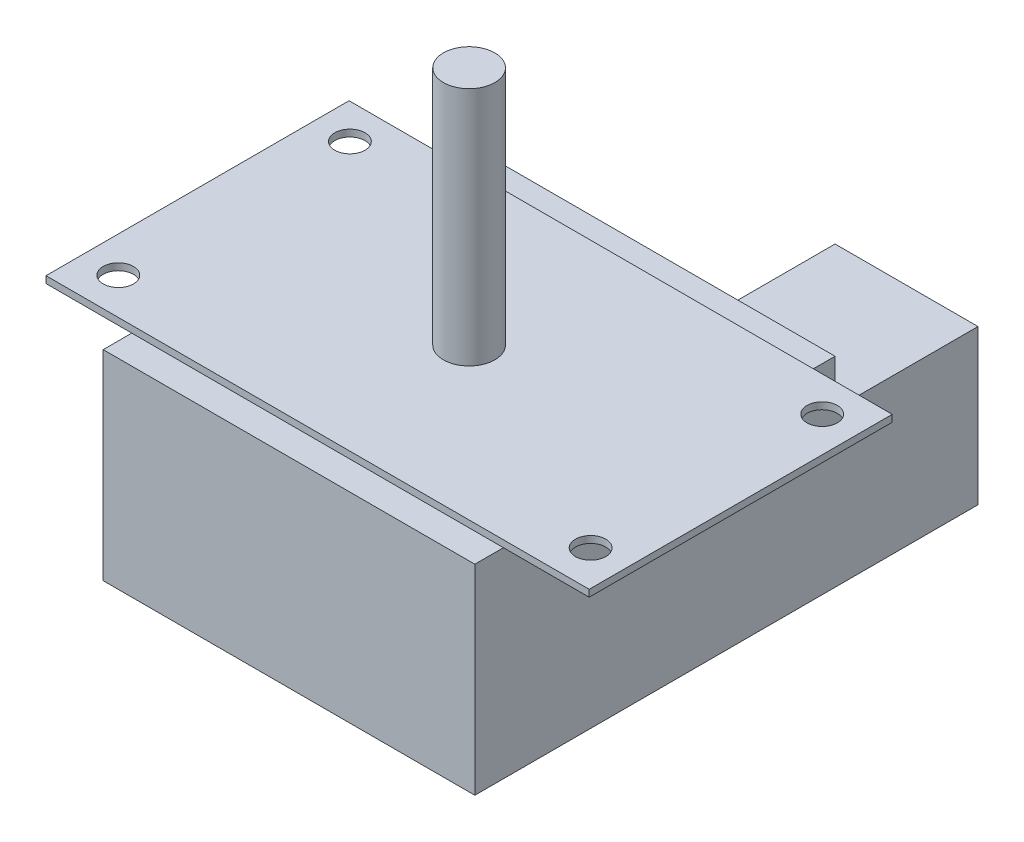
ISO-10303-21;
HEADER;
FILE_DESCRIPTION(('STEP AP214'),'2;1');
FILE_NAME('part.step','',(''),(''),'','','');
FILE_SCHEMA(('AUTOMOTIVE_DESIGN { 1 0 10303 214 1 1 1 1 }'));
ENDSEC;
DATA;
#1=APPLICATION_CONTEXT('core data for automotive mechanical design processes');
#2=APPLICATION_PROTOCOL_DEFINITION('international standard','automotive_design',2000,#1);
#3=PRODUCT_CONTEXT('',#1,'mechanical');
#4=PRODUCT('Part','Part','',(#3));
#5=PRODUCT_RELATED_PRODUCT_CATEGORY('part','',(#4));
#6=PRODUCT_DEFINITION_FORMATION('','',#4);
#7=PRODUCT_DEFINITION_CONTEXT('part definition',#1,'design');
#8=PRODUCT_DEFINITION('design','',#6,#7);
#9=PRODUCT_DEFINITION_SHAPE('','',#8);
#10=(LENGTH_UNIT() NAMED_UNIT(*) SI_UNIT(.MILLI.,.METRE.));
#11=(NAMED_UNIT(*) PLANE_ANGLE_UNIT() SI_UNIT($,.RADIAN.));
#12=(NAMED_UNIT(*) SI_UNIT($,.STERADIAN.) SOLID_ANGLE_UNIT());
#13=UNCERTAINTY_MEASURE_WITH_UNIT(LENGTH_MEASURE(1.E-05),#10,'distance_accuracy_value','');
#14=(GEOMETRIC_REPRESENTATION_CONTEXT(3) GLOBAL_UNCERTAINTY_ASSIGNED_CONTEXT((#13)) GLOBAL_UNIT_ASSIGNED_CONTEXT((#10,
#11,#12)) REPRESENTATION_CONTEXT('',''));
#15=CARTESIAN_POINT('',(0.,0.,0.));
#16=DIRECTION('',(0.,0.,1.));
#17=DIRECTION('',(1.,0.,0.));
#18=AXIS2_PLACEMENT_3D('',#15,#16,#17);
#19=CARTESIAN_POINT('',(0.,0.,0.));
#20=DIRECTION('',(0.,1.,0.));
#21=DIRECTION('',(0.,0.,1.));
#22=AXIS2_PLACEMENT_3D('',#19,#20,#21);
#23=PLANE('',#22);
#24=CARTESIAN_POINT('',(41.35,0.,20.1));
#25=DIRECTION('',(0.,1.,0.));
#26=DIRECTION('',(0.,0.,1.));
#27=AXIS2_PLACEMENT_3D('',#24,#25,#26);
#28=CIRCLE('',#27,2.64999999999999);
#29=CARTESIAN_POINT('',(41.35,0.,22.75));
#30=VERTEX_POINT('',#29);
#31=EDGE_CURVE('E277',#30,#30,#28,.T.);
#32=ORIENTED_EDGE('',*,*,#31,.T.);
#33=EDGE_LOOP('',(#32));
#34=FACE_BOUND('',#33,.T.);
#35=CARTESIAN_POINT('',(41.35,0.,-20.4));
#36=DIRECTION('',(0.,1.,0.));
#37=DIRECTION('',(0.,0.,1.));
#38=AXIS2_PLACEMENT_3D('',#35,#36,#37);
#39=CIRCLE('',#38,2.64999999999999);
#40=CARTESIAN_POINT('',(41.35,0.,-17.75));
#41=VERTEX_POINT('',#40);
#42=EDGE_CURVE('E269',#41,#41,#39,.T.);
#43=ORIENTED_EDGE('',*,*,#42,.T.);
#44=EDGE_LOOP('',(#43));
#45=FACE_BOUND('',#44,.T.);
#46=DIRECTION('',(0.,0.,1.));
#47=VECTOR('',#46,1.);
#48=CARTESIAN_POINT('',(32.5,0.,31.5));
#49=LINE('',#48,#47);
#50=CARTESIAN_POINT('',(32.5,0.,-26.5));
#51=VERTEX_POINT('',#50);
#52=CARTESIAN_POINT('',(32.5,0.,26.5));
#53=VERTEX_POINT('',#52);
#54=EDGE_CURVE('E11',#51,#53,#49,.T.);
#55=ORIENTED_EDGE('',*,*,#54,.F.);
#56=DIRECTION('',(1.,0.,0.));
#57=VECTOR('',#56,1.);
#58=CARTESIAN_POINT('',(-47.5,0.,-26.5));
#59=LINE('',#58,#57);
#60=CARTESIAN_POINT('',(47.5,0.,-26.5));
#61=VERTEX_POINT('',#60);
#62=EDGE_CURVE('E173',#51,#61,#59,.T.);
#63=ORIENTED_EDGE('',*,*,#62,.T.);
#64=DIRECTION('',(0.,0.,-1.));
#65=VECTOR('',#64,1.);
#66=CARTESIAN_POINT('',(47.5,0.,26.5));
#67=LINE('',#66,#65);
#68=CARTESIAN_POINT('',(47.5,0.,26.5));
#69=VERTEX_POINT('',#68);
#70=EDGE_CURVE('E187',#69,#61,#67,.T.);
#71=ORIENTED_EDGE('',*,*,#70,.F.);
#72=DIRECTION('',(1.,0.,0.));
#73=VECTOR('',#72,1.);
#74=CARTESIAN_POINT('',(-47.5,0.,26.5));
#75=LINE('',#74,#73);
#76=EDGE_CURVE('E52',#53,#69,#75,.T.);
#77=ORIENTED_EDGE('',*,*,#76,.F.);
#78=EDGE_LOOP('',(#55,#63,#71,#77));
#79=FACE_BOUND('',#78,.T.);
#80=ADVANCED_FACE('F33',(#34,#45,#79),#23,.F.);
#81=CARTESIAN_POINT('',(-41.25,0.,-20.4));
#82=DIRECTION('',(0.,1.,0.));
#83=DIRECTION('',(0.,0.,1.));
#84=AXIS2_PLACEMENT_3D('',#81,#82,#83);
#85=CIRCLE('',#84,2.64999999999999);
#86=CARTESIAN_POINT('',(-41.25,0.,-17.75));
#87=VERTEX_POINT('',#86);
#88=EDGE_CURVE('E289',#87,#87,#85,.T.);
#89=ORIENTED_EDGE('',*,*,#88,.T.);
#90=EDGE_LOOP('',(#89));
#91=FACE_BOUND('',#90,.T.);
#92=CARTESIAN_POINT('',(-41.25,0.,20.1));
#93=DIRECTION('',(0.,1.,0.));
#94=DIRECTION('',(0.,0.,1.));
#95=AXIS2_PLACEMENT_3D('',#92,#93,#94);
#96=CIRCLE('',#95,2.64999999999999);
#97=CARTESIAN_POINT('',(-41.25,0.,22.75));
#98=VERTEX_POINT('',#97);
#99=EDGE_CURVE('E283',#98,#98,#96,.T.);
#100=ORIENTED_EDGE('',*,*,#99,.T.);
#101=EDGE_LOOP('',(#100));
#102=FACE_BOUND('',#101,.T.);
#103=DIRECTION('',(0.,0.,-1.));
#104=VECTOR('',#103,1.);
#105=CARTESIAN_POINT('',(-32.5,0.,-31.5));
#106=LINE('',#105,#104);
#107=CARTESIAN_POINT('',(-32.5,0.,26.5));
#108=VERTEX_POINT('',#107);
#109=CARTESIAN_POINT('',(-32.5,0.,-26.5));
#110=VERTEX_POINT('',#109);
#111=EDGE_CURVE('E42',#108,#110,#106,.T.);
#112=ORIENTED_EDGE('',*,*,#111,.F.);
#113=CARTESIAN_POINT('',(-47.5,0.,26.5));
#114=VERTEX_POINT('',#113);
#115=EDGE_CURVE('E191',#114,#108,#75,.T.);
#116=ORIENTED_EDGE('',*,*,#115,.F.);
#117=DIRECTION('',(0.,0.,-1.));
#118=VECTOR('',#117,1.);
#119=CARTESIAN_POINT('',(-47.5,0.,26.5));
#120=LINE('',#119,#118);
#121=CARTESIAN_POINT('',(-47.5,0.,-26.5));
#122=VERTEX_POINT('',#121);
#123=EDGE_CURVE('E178',#114,#122,#120,.T.);
#124=ORIENTED_EDGE('',*,*,#123,.T.);
#125=EDGE_CURVE('E185',#122,#110,#59,.T.);
#126=ORIENTED_EDGE('',*,*,#125,.T.);
#127=EDGE_LOOP('',(#112,#116,#124,#126));
#128=FACE_BOUND('',#127,.T.);
#129=ADVANCED_FACE('F220',(#91,#102,#128),#23,.F.);
#130=CARTESIAN_POINT('',(-47.5,1.2,-26.5));
#131=DIRECTION('',(0.,0.,-1.));
#132=DIRECTION('',(-1.,0.,0.));
#133=AXIS2_PLACEMENT_3D('',#130,#131,#132);
#134=PLANE('',#133);
#135=ORIENTED_EDGE('',*,*,#125,.F.);
#136=DIRECTION('',(0.,-1.,0.));
#137=VECTOR('',#136,1.);
#138=CARTESIAN_POINT('',(-47.5,1.2,-26.5));
#139=LINE('',#138,#137);
#140=CARTESIAN_POINT('',(-47.5,1.2,-26.5));
#141=VERTEX_POINT('',#140);
#142=EDGE_CURVE('E196',#141,#122,#139,.T.);
#143=ORIENTED_EDGE('',*,*,#142,.F.);
#144=DIRECTION('',(1.,0.,0.));
#145=VECTOR('',#144,1.);
#146=CARTESIAN_POINT('',(-47.5,1.2,-26.5));
#147=LINE('',#146,#145);
#148=CARTESIAN_POINT('',(47.5,1.2,-26.5));
#149=VERTEX_POINT('',#148);
#150=EDGE_CURVE('E174',#141,#149,#147,.T.);
#151=ORIENTED_EDGE('',*,*,#150,.T.);
#152=DIRECTION('',(0.,-1.,0.));
#153=VECTOR('',#152,1.);
#154=CARTESIAN_POINT('',(47.5,1.2,-26.5));
#155=LINE('',#154,#153);
#156=EDGE_CURVE('E37',#149,#61,#155,.T.);
#157=ORIENTED_EDGE('',*,*,#156,.T.);
#158=ORIENTED_EDGE('',*,*,#62,.F.);
#159=EDGE_CURVE('E188',#110,#51,#59,.T.);
#160=ORIENTED_EDGE('',*,*,#159,.F.);
#161=EDGE_LOOP('',(#135,#143,#151,#157,#158,#160));
#162=FACE_BOUND('',#161,.T.);
#163=ADVANCED_FACE('F35',(#162),#134,.T.);
#164=CARTESIAN_POINT('',(-47.5,1.2,26.5));
#165=DIRECTION('',(-1.,0.,0.));
#166=DIRECTION('',(0.,0.,1.));
#167=AXIS2_PLACEMENT_3D('',#164,#165,#166);
#168=PLANE('',#167);
#169=ORIENTED_EDGE('',*,*,#123,.F.);
#170=DIRECTION('',(0.,-1.,0.));
#171=VECTOR('',#170,1.);
#172=CARTESIAN_POINT('',(-47.5,1.2,26.5));
#173=LINE('',#172,#171);
#174=CARTESIAN_POINT('',(-47.5,1.2,26.5));
#175=VERTEX_POINT('',#174);
#176=EDGE_CURVE('E198',#175,#114,#173,.T.);
#177=ORIENTED_EDGE('',*,*,#176,.F.);
#178=DIRECTION('',(0.,0.,-1.));
#179=VECTOR('',#178,1.);
#180=CARTESIAN_POINT('',(-47.5,1.2,26.5));
#181=LINE('',#180,#179);
#182=EDGE_CURVE('E182',#175,#141,#181,.T.);
#183=ORIENTED_EDGE('',*,*,#182,.T.);
#184=ORIENTED_EDGE('',*,*,#142,.T.);
#185=EDGE_LOOP('',(#169,#177,#183,#184));
#186=FACE_BOUND('',#185,.T.);
#187=ADVANCED_FACE('F222',(#186),#168,.T.);
#188=CARTESIAN_POINT('',(-47.5,1.2,26.5));
#189=DIRECTION('',(0.,0.,-1.));
#190=DIRECTION('',(-1.,0.,0.));
#191=AXIS2_PLACEMENT_3D('',#188,#189,#190);
#192=PLANE('',#191);
#193=ORIENTED_EDGE('',*,*,#115,.T.);
#194=EDGE_CURVE('E193',#108,#53,#75,.T.);
#195=ORIENTED_EDGE('',*,*,#194,.T.);
#196=ORIENTED_EDGE('',*,*,#76,.T.);
#197=DIRECTION('',(0.,-1.,0.));
#198=VECTOR('',#197,1.);
#199=CARTESIAN_POINT('',(47.5,1.2,26.5));
#200=LINE('',#199,#198);
#201=CARTESIAN_POINT('',(47.5,1.2,26.5));
#202=VERTEX_POINT('',#201);
#203=EDGE_CURVE('E199',#202,#69,#200,.T.);
#204=ORIENTED_EDGE('',*,*,#203,.F.);
#205=DIRECTION('',(1.,0.,0.));
#206=VECTOR('',#205,1.);
#207=CARTESIAN_POINT('',(-47.5,1.2,26.5));
#208=LINE('',#207,#206);
#209=EDGE_CURVE('E180',#175,#202,#208,.T.);
#210=ORIENTED_EDGE('',*,*,#209,.F.);
#211=ORIENTED_EDGE('',*,*,#176,.T.);
#212=EDGE_LOOP('',(#193,#195,#196,#204,#210,#211));
#213=FACE_BOUND('',#212,.T.);
#214=ADVANCED_FACE('F228',(#213),#192,.F.);
#215=CARTESIAN_POINT('',(47.5,1.2,26.5));
#216=DIRECTION('',(-1.,0.,0.));
#217=DIRECTION('',(0.,0.,1.));
#218=AXIS2_PLACEMENT_3D('',#215,#216,#217);
#219=PLANE('',#218);
#220=ORIENTED_EDGE('',*,*,#70,.T.);
#221=ORIENTED_EDGE('',*,*,#156,.F.);
#222=DIRECTION('',(0.,0.,-1.));
#223=VECTOR('',#222,1.);
#224=CARTESIAN_POINT('',(47.5,1.2,26.5));
#225=LINE('',#224,#223);
#226=EDGE_CURVE('E177',#202,#149,#225,.T.);
#227=ORIENTED_EDGE('',*,*,#226,.F.);
#228=ORIENTED_EDGE('',*,*,#203,.T.);
#229=EDGE_LOOP('',(#220,#221,#227,#228));
#230=FACE_BOUND('',#229,.T.);
#231=ADVANCED_FACE('F212',(#230),#219,.F.);
#232=CARTESIAN_POINT('',(0.,1.2,0.));
#233=DIRECTION('',(0.,1.,0.));
#234=DIRECTION('',(0.,0.,1.));
#235=AXIS2_PLACEMENT_3D('',#232,#233,#234);
#236=PLANE('',#235);
#237=CARTESIAN_POINT('',(-41.25,1.2,-20.4));
#238=DIRECTION('',(0.,1.,0.));
#239=DIRECTION('',(0.,0.,1.));
#240=AXIS2_PLACEMENT_3D('',#237,#238,#239);
#241=CIRCLE('',#240,2.64999999999999);
#242=CARTESIAN_POINT('',(-41.25,1.2,-17.75));
#243=VERTEX_POINT('',#242);
#244=EDGE_CURVE('E292',#243,#243,#241,.T.);
#245=ORIENTED_EDGE('',*,*,#244,.F.);
#246=EDGE_LOOP('',(#245));
#247=FACE_BOUND('',#246,.T.);
#248=CARTESIAN_POINT('',(-41.25,1.2,20.1));
#249=DIRECTION('',(0.,1.,0.));
#250=DIRECTION('',(0.,0.,1.));
#251=AXIS2_PLACEMENT_3D('',#248,#249,#250);
#252=CIRCLE('',#251,2.64999999999999);
#253=CARTESIAN_POINT('',(-41.25,1.2,22.75));
#254=VERTEX_POINT('',#253);
#255=EDGE_CURVE('E286',#254,#254,#252,.T.);
#256=ORIENTED_EDGE('',*,*,#255,.F.);
#257=EDGE_LOOP('',(#256));
#258=FACE_BOUND('',#257,.T.);
#259=CARTESIAN_POINT('',(41.35,1.2,20.1));
#260=DIRECTION('',(0.,1.,0.));
#261=DIRECTION('',(0.,0.,1.));
#262=AXIS2_PLACEMENT_3D('',#259,#260,#261);
#263=CIRCLE('',#262,2.64999999999999);
#264=CARTESIAN_POINT('',(41.35,1.2,22.75));
#265=VERTEX_POINT('',#264);
#266=EDGE_CURVE('E280',#265,#265,#263,.T.);
#267=ORIENTED_EDGE('',*,*,#266,.F.);
#268=EDGE_LOOP('',(#267));
#269=FACE_BOUND('',#268,.T.);
#270=CARTESIAN_POINT('',(41.35,1.2,-20.4));
#271=DIRECTION('',(0.,1.,0.));
#272=DIRECTION('',(0.,0.,1.));
#273=AXIS2_PLACEMENT_3D('',#270,#271,#272);
#274=CIRCLE('',#273,2.64999999999999);
#275=CARTESIAN_POINT('',(41.35,1.2,-17.75));
#276=VERTEX_POINT('',#275);
#277=EDGE_CURVE('E274',#276,#276,#274,.T.);
#278=ORIENTED_EDGE('',*,*,#277,.F.);
#279=EDGE_LOOP('',(#278));
#280=FACE_BOUND('',#279,.T.);
#281=CARTESIAN_POINT('',(0.,1.2,0.));
#282=DIRECTION('',(0.,1.,0.));
#283=DIRECTION('',(0.,0.,1.));
#284=AXIS2_PLACEMENT_3D('',#281,#282,#283);
#285=CIRCLE('',#284,4.5);
#286=CARTESIAN_POINT('',(0.,1.2,-4.5));
#287=VERTEX_POINT('',#286);
#288=EDGE_CURVE('E266',#287,#287,#285,.T.);
#289=ORIENTED_EDGE('',*,*,#288,.F.);
#290=EDGE_LOOP('',(#289));
#291=FACE_BOUND('',#290,.T.);
#292=ORIENTED_EDGE('',*,*,#150,.F.);
#293=ORIENTED_EDGE('',*,*,#182,.F.);
#294=ORIENTED_EDGE('',*,*,#209,.T.);
#295=ORIENTED_EDGE('',*,*,#226,.T.);
#296=EDGE_LOOP('',(#292,#293,#294,#295));
#297=FACE_BOUND('',#296,.T.);
#298=ADVANCED_FACE('F226',(#247,#258,#269,#280,#291,#297),#236,.T.);
#299=CARTESIAN_POINT('',(0.,0.,0.));
#300=DIRECTION('',(0.,1.,0.));
#301=DIRECTION('',(0.,0.,1.));
#302=AXIS2_PLACEMENT_3D('',#299,#300,#301);
#303=PLANE('',#302);
#304=ORIENTED_EDGE('',*,*,#194,.F.);
#305=CARTESIAN_POINT('',(-32.5,0.,31.5));
#306=VERTEX_POINT('',#305);
#307=EDGE_CURVE('E245',#306,#108,#106,.T.);
#308=ORIENTED_EDGE('',*,*,#307,.F.);
#309=DIRECTION('',(-1.,0.,0.));
#310=VECTOR('',#309,1.);
#311=CARTESIAN_POINT('',(-32.5,0.,31.5));
#312=LINE('',#311,#310);
#313=CARTESIAN_POINT('',(32.5,0.,31.5));
#314=VERTEX_POINT('',#313);
#315=EDGE_CURVE('E236',#314,#306,#312,.T.);
#316=ORIENTED_EDGE('',*,*,#315,.F.);
#317=EDGE_CURVE('E45',#53,#314,#49,.T.);
#318=ORIENTED_EDGE('',*,*,#317,.F.);
#319=EDGE_LOOP('',(#304,#308,#316,#318));
#320=FACE_BOUND('',#319,.T.);
#321=ADVANCED_FACE('F235',(#320),#303,.T.);
#322=CARTESIAN_POINT('',(32.5,-35.,31.5));
#323=DIRECTION('',(-1.,0.,0.));
#324=DIRECTION('',(0.,0.,1.));
#325=AXIS2_PLACEMENT_3D('',#322,#323,#324);
#326=PLANE('',#325);
#327=DIRECTION('',(0.,0.,-1.));
#328=VECTOR('',#327,1.);
#329=CARTESIAN_POINT('',(32.5,-8.,-31.5));
#330=LINE('',#329,#328);
#331=CARTESIAN_POINT('',(32.5,-8.,-31.5));
#332=VERTEX_POINT('',#331);
#333=CARTESIAN_POINT('',(32.5,-8.,-56.5));
#334=VERTEX_POINT('',#333);
#335=EDGE_CURVE('E144',#332,#334,#330,.T.);
#336=ORIENTED_EDGE('',*,*,#335,.F.);
#337=DIRECTION('',(0.,1.,0.));
#338=VECTOR('',#337,1.);
#339=CARTESIAN_POINT('',(32.5,-8.,-31.5));
#340=LINE('',#339,#338);
#341=CARTESIAN_POINT('',(32.5,0.,-31.5));
#342=VERTEX_POINT('',#341);
#343=EDGE_CURVE('E141',#332,#342,#340,.T.);
#344=ORIENTED_EDGE('',*,*,#343,.T.);
#345=EDGE_CURVE('E44',#342,#51,#49,.T.);
#346=ORIENTED_EDGE('',*,*,#345,.T.);
#347=ORIENTED_EDGE('',*,*,#54,.T.);
#348=ORIENTED_EDGE('',*,*,#317,.T.);
#349=DIRECTION('',(0.,1.,0.));
#350=VECTOR('',#349,1.);
#351=CARTESIAN_POINT('',(32.5,-35.,31.5));
#352=LINE('',#351,#350);
#353=CARTESIAN_POINT('',(32.5,-35.,31.5));
#354=VERTEX_POINT('',#353);
#355=EDGE_CURVE('E170',#354,#314,#352,.T.);
#356=ORIENTED_EDGE('',*,*,#355,.F.);
#357=DIRECTION('',(0.,0.,1.));
#358=VECTOR('',#357,1.);
#359=CARTESIAN_POINT('',(32.5,-35.,31.5));
#360=LINE('',#359,#358);
#361=CARTESIAN_POINT('',(32.5,-35.,-56.5));
#362=VERTEX_POINT('',#361);
#363=EDGE_CURVE('E248',#362,#354,#360,.T.);
#364=ORIENTED_EDGE('',*,*,#363,.F.);
#365=DIRECTION('',(0.,1.,0.));
#366=VECTOR('',#365,1.);
#367=CARTESIAN_POINT('',(32.5,-35.,-56.5));
#368=LINE('',#367,#366);
#369=EDGE_CURVE('E164',#362,#334,#368,.T.);
#370=ORIENTED_EDGE('',*,*,#369,.T.);
#371=EDGE_LOOP('',(#336,#344,#346,#347,#348,#356,#364,#370));
#372=FACE_BOUND('',#371,.T.);
#373=ADVANCED_FACE('F239',(#372),#326,.F.);
#374=CARTESIAN_POINT('',(-32.5,-35.,31.5));
#375=DIRECTION('',(0.,0.,-1.));
#376=DIRECTION('',(-1.,0.,0.));
#377=AXIS2_PLACEMENT_3D('',#374,#375,#376);
#378=PLANE('',#377);
#379=ORIENTED_EDGE('',*,*,#315,.T.);
#380=DIRECTION('',(0.,1.,0.));
#381=VECTOR('',#380,1.);
#382=CARTESIAN_POINT('',(-32.5,-35.,31.5));
#383=LINE('',#382,#381);
#384=CARTESIAN_POINT('',(-32.5,-35.,31.5));
#385=VERTEX_POINT('',#384);
#386=EDGE_CURVE('E162',#385,#306,#383,.T.);
#387=ORIENTED_EDGE('',*,*,#386,.F.);
#388=DIRECTION('',(-1.,0.,0.));
#389=VECTOR('',#388,1.);
#390=CARTESIAN_POINT('',(-32.5,-35.,31.5));
#391=LINE('',#390,#389);
#392=EDGE_CURVE('E260',#354,#385,#391,.T.);
#393=ORIENTED_EDGE('',*,*,#392,.F.);
#394=ORIENTED_EDGE('',*,*,#355,.T.);
#395=EDGE_LOOP('',(#379,#387,#393,#394));
#396=FACE_BOUND('',#395,.T.);
#397=ADVANCED_FACE('F362',(#396),#378,.F.);
#398=CARTESIAN_POINT('',(-32.5,-35.,-31.5));
#399=DIRECTION('',(1.,0.,0.));
#400=DIRECTION('',(0.,0.,-1.));
#401=AXIS2_PLACEMENT_3D('',#398,#399,#400);
#402=PLANE('',#401);
#403=ORIENTED_EDGE('',*,*,#307,.T.);
#404=ORIENTED_EDGE('',*,*,#111,.T.);
#405=CARTESIAN_POINT('',(-32.5,0.,-31.5));
#406=VERTEX_POINT('',#405);
#407=EDGE_CURVE('E218',#110,#406,#106,.T.);
#408=ORIENTED_EDGE('',*,*,#407,.T.);
#409=DIRECTION('',(0.,1.,0.));
#410=VECTOR('',#409,1.);
#411=CARTESIAN_POINT('',(-32.5,-35.,-31.5));
#412=LINE('',#411,#410);
#413=CARTESIAN_POINT('',(-32.5,-35.,-31.5));
#414=VERTEX_POINT('',#413);
#415=EDGE_CURVE('E158',#414,#406,#412,.T.);
#416=ORIENTED_EDGE('',*,*,#415,.F.);
#417=DIRECTION('',(0.,0.,-1.));
#418=VECTOR('',#417,1.);
#419=CARTESIAN_POINT('',(-32.5,-35.,-31.5));
#420=LINE('',#419,#418);
#421=EDGE_CURVE('E256',#385,#414,#420,.T.);
#422=ORIENTED_EDGE('',*,*,#421,.F.);
#423=ORIENTED_EDGE('',*,*,#386,.T.);
#424=EDGE_LOOP('',(#403,#404,#408,#416,#422,#423));
#425=FACE_BOUND('',#424,.T.);
#426=ADVANCED_FACE('F369',(#425),#402,.F.);
#427=CARTESIAN_POINT('',(7.49999999999999,-35.,-31.5));
#428=DIRECTION('',(0.,0.,1.));
#429=DIRECTION('',(1.,0.,0.));
#430=AXIS2_PLACEMENT_3D('',#427,#428,#429);
#431=PLANE('',#430);
#432=DIRECTION('',(1.,0.,0.));
#433=VECTOR('',#432,1.);
#434=CARTESIAN_POINT('',(7.49999999999999,0.,-31.5));
#435=LINE('',#434,#433);
#436=EDGE_CURVE('E247',#406,#342,#435,.T.);
#437=ORIENTED_EDGE('',*,*,#436,.T.);
#438=ORIENTED_EDGE('',*,*,#343,.F.);
#439=DIRECTION('',(1.,0.,0.));
#440=VECTOR('',#439,1.);
#441=CARTESIAN_POINT('',(7.49999999999999,-8.,-31.5));
#442=LINE('',#441,#440);
#443=CARTESIAN_POINT('',(7.49999999999999,-8.,-31.5));
#444=VERTEX_POINT('',#443);
#445=EDGE_CURVE('E133',#444,#332,#442,.T.);
#446=ORIENTED_EDGE('',*,*,#445,.F.);
#447=DIRECTION('',(0.,1.,0.));
#448=VECTOR('',#447,1.);
#449=CARTESIAN_POINT('',(7.49999999999999,-35.,-31.5));
#450=LINE('',#449,#448);
#451=CARTESIAN_POINT('',(7.49999999999999,-35.,-31.5));
#452=VERTEX_POINT('',#451);
#453=EDGE_CURVE('E138',#452,#444,#450,.T.);
#454=ORIENTED_EDGE('',*,*,#453,.F.);
#455=DIRECTION('',(1.,0.,0.));
#456=VECTOR('',#455,1.);
#457=CARTESIAN_POINT('',(7.49999999999999,-35.,-31.5));
#458=LINE('',#457,#456);
#459=EDGE_CURVE('E255',#414,#452,#458,.T.);
#460=ORIENTED_EDGE('',*,*,#459,.F.);
#461=ORIENTED_EDGE('',*,*,#415,.T.);
#462=EDGE_LOOP('',(#437,#438,#446,#454,#460,#461));
#463=FACE_BOUND('',#462,.T.);
#464=ADVANCED_FACE('F135',(#463),#431,.F.);
#465=CARTESIAN_POINT('',(7.49999999999999,-35.,-56.5));
#466=DIRECTION('',(1.,0.,0.));
#467=DIRECTION('',(0.,0.,-1.));
#468=AXIS2_PLACEMENT_3D('',#465,#466,#467);
#469=PLANE('',#468);
#470=ORIENTED_EDGE('',*,*,#453,.T.);
#471=DIRECTION('',(0.,0.,1.));
#472=VECTOR('',#471,1.);
#473=CARTESIAN_POINT('',(7.49999999999999,-8.,-31.5));
#474=LINE('',#473,#472);
#475=CARTESIAN_POINT('',(7.49999999999999,-8.,-56.5));
#476=VERTEX_POINT('',#475);
#477=EDGE_CURVE('E145',#476,#444,#474,.T.);
#478=ORIENTED_EDGE('',*,*,#477,.F.);
#479=DIRECTION('',(0.,1.,0.));
#480=VECTOR('',#479,1.);
#481=CARTESIAN_POINT('',(7.49999999999999,-35.,-56.5));
#482=LINE('',#481,#480);
#483=CARTESIAN_POINT('',(7.49999999999999,-35.,-56.5));
#484=VERTEX_POINT('',#483);
#485=EDGE_CURVE('E159',#484,#476,#482,.T.);
#486=ORIENTED_EDGE('',*,*,#485,.F.);
#487=DIRECTION('',(0.,0.,-1.));
#488=VECTOR('',#487,1.);
#489=CARTESIAN_POINT('',(7.49999999999999,-35.,-56.5));
#490=LINE('',#489,#488);
#491=EDGE_CURVE('E157',#452,#484,#490,.T.);
#492=ORIENTED_EDGE('',*,*,#491,.F.);
#493=EDGE_LOOP('',(#470,#478,#486,#492));
#494=FACE_BOUND('',#493,.T.);
#495=ADVANCED_FACE('F156',(#494),#469,.F.);
#496=CARTESIAN_POINT('',(32.5,-35.,-56.5));
#497=DIRECTION('',(0.,0.,1.));
#498=DIRECTION('',(1.,0.,0.));
#499=AXIS2_PLACEMENT_3D('',#496,#497,#498);
#500=PLANE('',#499);
#501=ORIENTED_EDGE('',*,*,#485,.T.);
#502=DIRECTION('',(-1.,0.,0.));
#503=VECTOR('',#502,1.);
#504=CARTESIAN_POINT('',(7.49999999999999,-8.,-56.5));
#505=LINE('',#504,#503);
#506=EDGE_CURVE('E150',#334,#476,#505,.T.);
#507=ORIENTED_EDGE('',*,*,#506,.F.);
#508=ORIENTED_EDGE('',*,*,#369,.F.);
#509=DIRECTION('',(1.,0.,0.));
#510=VECTOR('',#509,1.);
#511=CARTESIAN_POINT('',(32.5,-35.,-56.5));
#512=LINE('',#511,#510);
#513=EDGE_CURVE('E242',#484,#362,#512,.T.);
#514=ORIENTED_EDGE('',*,*,#513,.F.);
#515=EDGE_LOOP('',(#501,#507,#508,#514));
#516=FACE_BOUND('',#515,.T.);
#517=ADVANCED_FACE('F389',(#516),#500,.F.);
#518=CARTESIAN_POINT('',(0.,-35.,0.));
#519=DIRECTION('',(0.,1.,0.));
#520=DIRECTION('',(0.,0.,1.));
#521=AXIS2_PLACEMENT_3D('',#518,#519,#520);
#522=PLANE('',#521);
#523=ORIENTED_EDGE('',*,*,#363,.T.);
#524=ORIENTED_EDGE('',*,*,#392,.T.);
#525=ORIENTED_EDGE('',*,*,#421,.T.);
#526=ORIENTED_EDGE('',*,*,#459,.T.);
#527=ORIENTED_EDGE('',*,*,#491,.T.);
#528=ORIENTED_EDGE('',*,*,#513,.T.);
#529=EDGE_LOOP('',(#523,#524,#525,#526,#527,#528));
#530=FACE_BOUND('',#529,.T.);
#531=ADVANCED_FACE('F396',(#530),#522,.F.);
#532=ORIENTED_EDGE('',*,*,#345,.F.);
#533=ORIENTED_EDGE('',*,*,#436,.F.);
#534=ORIENTED_EDGE('',*,*,#407,.F.);
#535=ORIENTED_EDGE('',*,*,#159,.T.);
#536=EDGE_LOOP('',(#532,#533,#534,#535));
#537=FACE_BOUND('',#536,.T.);
#538=ADVANCED_FACE('F216',(#537),#303,.T.);
#539=CARTESIAN_POINT('',(0.,-8.,0.));
#540=DIRECTION('',(0.,-1.,0.));
#541=DIRECTION('',(0.,0.,-1.));
#542=AXIS2_PLACEMENT_3D('',#539,#540,#541);
#543=PLANE('',#542);
#544=ORIENTED_EDGE('',*,*,#477,.T.);
#545=ORIENTED_EDGE('',*,*,#445,.T.);
#546=ORIENTED_EDGE('',*,*,#335,.T.);
#547=ORIENTED_EDGE('',*,*,#506,.T.);
#548=EDGE_LOOP('',(#544,#545,#546,#547));
#549=FACE_BOUND('',#548,.T.);
#550=ADVANCED_FACE('F148',(#549),#543,.F.);
#551=CARTESIAN_POINT('',(0.,43.2,0.));
#552=DIRECTION('',(0.,-1.,0.));
#553=DIRECTION('',(0.,0.,-1.));
#554=AXIS2_PLACEMENT_3D('',#551,#552,#553);
#555=CYLINDRICAL_SURFACE('',#554,4.5);
#556=CARTESIAN_POINT('',(0.,43.2,0.));
#557=DIRECTION('',(0.,1.,0.));
#558=DIRECTION('',(0.,0.,1.));
#559=AXIS2_PLACEMENT_3D('',#556,#557,#558);
#560=CIRCLE('',#559,4.5);
#561=CARTESIAN_POINT('',(0.,43.2,-4.5));
#562=VERTEX_POINT('',#561);
#563=EDGE_CURVE('E154',#562,#562,#560,.T.);
#564=CARTESIAN_POINT('',(0.,43.2,-4.5));
#565=CARTESIAN_POINT('',(0.,42.7625,-4.5));
#566=CARTESIAN_POINT('',(0.,42.325,-4.5));
#567=CARTESIAN_POINT('',(0.,41.45,-4.5));
#568=CARTESIAN_POINT('',(0.,41.0125,-4.5));
#569=CARTESIAN_POINT('',(0.,40.1375,-4.5));
#570=CARTESIAN_POINT('',(0.,39.7,-4.5));
#571=CARTESIAN_POINT('',(0.,38.825,-4.5));
#572=CARTESIAN_POINT('',(0.,38.3875,-4.5));
#573=CARTESIAN_POINT('',(0.,37.5125,-4.5));
#574=CARTESIAN_POINT('',(0.,37.075,-4.5));
#575=CARTESIAN_POINT('',(0.,36.2,-4.5));
#576=CARTESIAN_POINT('',(0.,35.7625,-4.5));
#577=CARTESIAN_POINT('',(0.,34.8875,-4.5));
#578=CARTESIAN_POINT('',(0.,34.45,-4.5));
#579=CARTESIAN_POINT('',(0.,33.575,-4.5));
#580=CARTESIAN_POINT('',(0.,33.1375,-4.5));
#581=CARTESIAN_POINT('',(0.,32.2625,-4.5));
#582=CARTESIAN_POINT('',(0.,31.825,-4.5));
#583=CARTESIAN_POINT('',(0.,30.95,-4.5));
#584=CARTESIAN_POINT('',(0.,30.5125,-4.5));
#585=CARTESIAN_POINT('',(0.,29.6375,-4.5));
#586=CARTESIAN_POINT('',(0.,29.2,-4.5));
#587=CARTESIAN_POINT('',(0.,28.325,-4.5));
#588=CARTESIAN_POINT('',(0.,27.8875,-4.5));
#589=CARTESIAN_POINT('',(0.,27.0125,-4.5));
#590=CARTESIAN_POINT('',(0.,26.575,-4.5));
#591=CARTESIAN_POINT('',(0.,25.7,-4.5));
#592=CARTESIAN_POINT('',(0.,25.2625,-4.5));
#593=CARTESIAN_POINT('',(0.,24.3875,-4.5));
#594=CARTESIAN_POINT('',(0.,23.95,-4.5));
#595=CARTESIAN_POINT('',(0.,23.075,-4.5));
#596=CARTESIAN_POINT('',(0.,22.6375,-4.5));
#597=CARTESIAN_POINT('',(0.,21.7625,-4.5));
#598=CARTESIAN_POINT('',(0.,21.325,-4.5));
#599=CARTESIAN_POINT('',(0.,20.45,-4.5));
#600=CARTESIAN_POINT('',(0.,20.0125,-4.5));
#601=CARTESIAN_POINT('',(0.,19.1375,-4.5));
#602=CARTESIAN_POINT('',(0.,18.7,-4.5));
#603=CARTESIAN_POINT('',(0.,17.825,-4.5));
#604=CARTESIAN_POINT('',(0.,17.3875,-4.5));
#605=CARTESIAN_POINT('',(0.,16.5125,-4.5));
#606=CARTESIAN_POINT('',(0.,16.075,-4.5));
#607=CARTESIAN_POINT('',(0.,15.2,-4.5));
#608=CARTESIAN_POINT('',(0.,14.7625,-4.5));
#609=CARTESIAN_POINT('',(0.,13.8875,-4.5));
#610=CARTESIAN_POINT('',(0.,13.45,-4.5));
#611=CARTESIAN_POINT('',(0.,12.575,-4.5));
#612=CARTESIAN_POINT('',(0.,12.1375,-4.5));
#613=CARTESIAN_POINT('',(0.,11.2625,-4.5));
#614=CARTESIAN_POINT('',(0.,10.825,-4.5));
#615=CARTESIAN_POINT('',(0.,9.95,-4.5));
#616=CARTESIAN_POINT('',(0.,9.5125,-4.5));
#617=CARTESIAN_POINT('',(0.,8.6375,-4.5));
#618=CARTESIAN_POINT('',(0.,8.2,-4.5));
#619=CARTESIAN_POINT('',(0.,7.325,-4.5));
#620=CARTESIAN_POINT('',(0.,6.8875,-4.5));
#621=CARTESIAN_POINT('',(0.,6.0125,-4.5));
#622=CARTESIAN_POINT('',(0.,5.575,-4.5));
#623=CARTESIAN_POINT('',(0.,4.7,-4.5));
#624=CARTESIAN_POINT('',(0.,4.2625,-4.5));
#625=CARTESIAN_POINT('',(0.,3.3875,-4.5));
#626=CARTESIAN_POINT('',(0.,2.95,-4.5));
#627=CARTESIAN_POINT('',(0.,2.075,-4.5));
#628=CARTESIAN_POINT('',(0.,1.6375,-4.5));
#629=CARTESIAN_POINT('',(0.,1.2,-4.5));
#630=B_SPLINE_CURVE_WITH_KNOTS('',3,(#564,#565,#566,#567,#568,#569,#570,#571,#572,#573,#574,
#575,#576,#577,#578,#579,#580,#581,#582,#583,#584,#585,#586,#587,#588,#589,#590,#591,#592,#593,
#594,#595,#596,#597,#598,#599,#600,#601,#602,#603,#604,#605,#606,#607,#608,#609,#610,#611,#612,
#613,#614,#615,#616,#617,#618,#619,#620,#621,#622,#623,#624,#625,#626,#627,#628,#629),
.UNSPECIFIED.,.F.,.F.,(4,2,2,2,2,2,2,2,2,2,2,2,2,2,2,2,2,2,2,2,2,2,2,2,2,2,2,2,2,2,2,2,4),(0.,
1.31249999999999,2.625,3.9375,5.25,6.5625,7.87499999999999,9.18749999999999,10.5,11.8125,13.125,
14.4375,15.75,17.0625,18.375,19.6875,21.,22.3125,23.625,24.9375,26.25,27.5625,28.875,30.1875,
31.5,32.8125,34.125,35.4375,36.75,38.0625,39.375,40.6875,42.),.UNSPECIFIED.);
#631=EDGE_CURVE('BSEAM309',#562,#287,#630,.T.);
#632=ORIENTED_EDGE('',*,*,#563,.F.);
#633=ORIENTED_EDGE('',*,*,#288,.T.);
#634=ORIENTED_EDGE('',*,*,#631,.T.);
#635=ORIENTED_EDGE('',*,*,#631,.F.);
#636=EDGE_LOOP('',(#632,#634,#633,#635));
#637=FACE_BOUND('',#636,.T.);
#638=ADVANCED_FACE('F309',(#637),#555,.T.);
#639=CARTESIAN_POINT('',(0.,43.2,0.));
#640=DIRECTION('',(0.,1.,0.));
#641=DIRECTION('',(0.,0.,1.));
#642=AXIS2_PLACEMENT_3D('',#639,#640,#641);
#643=PLANE('',#642);
#644=ORIENTED_EDGE('',*,*,#563,.T.);
#645=EDGE_LOOP('',(#644));
#646=FACE_BOUND('',#645,.T.);
#647=ADVANCED_FACE('F311',(#646),#643,.T.);
#648=CARTESIAN_POINT('',(41.35,1.2,-20.4));
#649=DIRECTION('',(0.,1.,0.));
#650=DIRECTION('',(0.,0.,1.));
#651=AXIS2_PLACEMENT_3D('',#648,#649,#650);
#652=CYLINDRICAL_SURFACE('',#651,2.64999999999999);
#653=ORIENTED_EDGE('',*,*,#42,.F.);
#654=EDGE_LOOP('',(#653));
#655=FACE_BOUND('',#654,.T.);
#656=ORIENTED_EDGE('',*,*,#277,.T.);
#657=EDGE_LOOP('',(#656));
#658=FACE_BOUND('',#657,.T.);
#659=ADVANCED_FACE('F318',(#655,#658),#652,.F.);
#660=CARTESIAN_POINT('',(41.35,1.2,20.1));
#661=DIRECTION('',(0.,1.,0.));
#662=DIRECTION('',(0.,0.,1.));
#663=AXIS2_PLACEMENT_3D('',#660,#661,#662);
#664=CYLINDRICAL_SURFACE('',#663,2.64999999999999);
#665=ORIENTED_EDGE('',*,*,#31,.F.);
#666=EDGE_LOOP('',(#665));
#667=FACE_BOUND('',#666,.T.);
#668=ORIENTED_EDGE('',*,*,#266,.T.);
#669=EDGE_LOOP('',(#668));
#670=FACE_BOUND('',#669,.T.);
#671=ADVANCED_FACE('F479',(#667,#670),#664,.F.);
#672=CARTESIAN_POINT('',(-41.25,1.2,20.1));
#673=DIRECTION('',(0.,1.,0.));
#674=DIRECTION('',(0.,0.,1.));
#675=AXIS2_PLACEMENT_3D('',#672,#673,#674);
#676=CYLINDRICAL_SURFACE('',#675,2.64999999999999);
#677=ORIENTED_EDGE('',*,*,#99,.F.);
#678=EDGE_LOOP('',(#677));
#679=FACE_BOUND('',#678,.T.);
#680=ORIENTED_EDGE('',*,*,#255,.T.);
#681=EDGE_LOOP('',(#680));
#682=FACE_BOUND('',#681,.T.);
#683=ADVANCED_FACE('F486',(#679,#682),#676,.F.);
#684=CARTESIAN_POINT('',(-41.25,1.2,-20.4));
#685=DIRECTION('',(0.,1.,0.));
#686=DIRECTION('',(0.,0.,1.));
#687=AXIS2_PLACEMENT_3D('',#684,#685,#686);
#688=CYLINDRICAL_SURFACE('',#687,2.64999999999999);
#689=ORIENTED_EDGE('',*,*,#88,.F.);
#690=EDGE_LOOP('',(#689));
#691=FACE_BOUND('',#690,.T.);
#692=ORIENTED_EDGE('',*,*,#244,.T.);
#693=EDGE_LOOP('',(#692));
#694=FACE_BOUND('',#693,.T.);
#695=ADVANCED_FACE('F296',(#691,#694),#688,.F.);
#696=CLOSED_SHELL('',(#80,#129,#163,#187,#214,#231,#298,#321,#373,#397,#426,#464,#495,#517,#531,
#538,#550,#638,#647,#659,#671,#683,#695));
#697=MANIFOLD_SOLID_BREP('B2',#696);
#698=ADVANCED_BREP_SHAPE_REPRESENTATION('',(#18,#697),#14);
#699=SHAPE_DEFINITION_REPRESENTATION(#9,#698);
ENDSEC;
END-ISO-10303-21;
